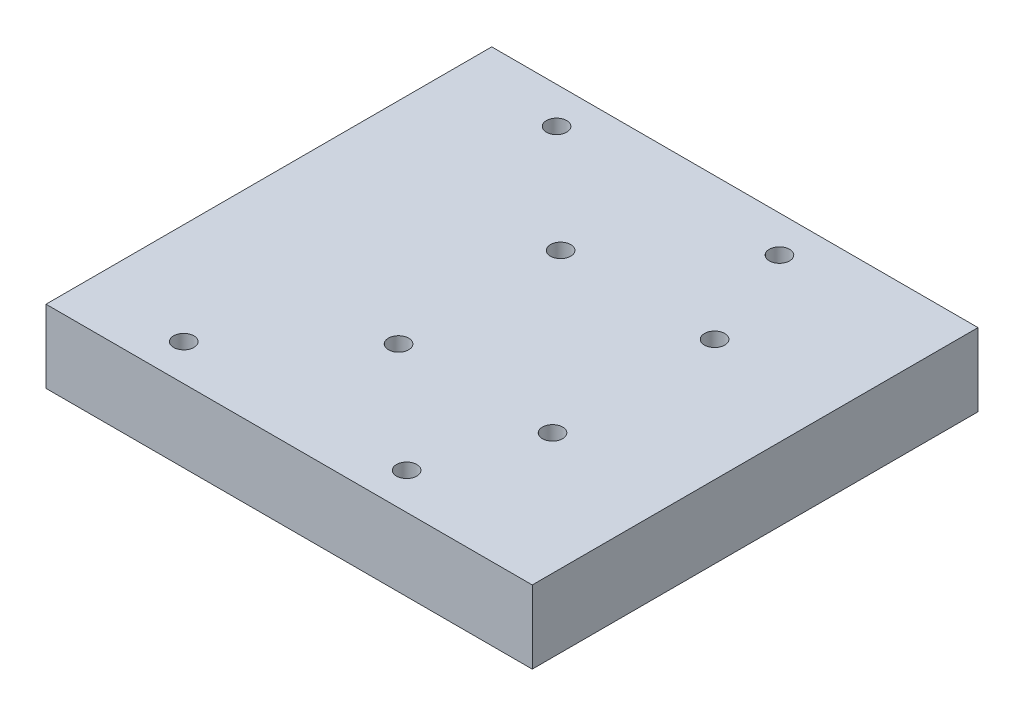
ISO-10303-21;
HEADER;
FILE_DESCRIPTION(('STEP AP214'),'2;1');
FILE_NAME('part.step','',(''),(''),'','','');
FILE_SCHEMA(('AUTOMOTIVE_DESIGN { 1 0 10303 214 1 1 1 1 }'));
ENDSEC;
DATA;
#1=APPLICATION_CONTEXT('core data for automotive mechanical design processes');
#2=APPLICATION_PROTOCOL_DEFINITION('international standard','automotive_design',2000,#1);
#3=PRODUCT_CONTEXT('',#1,'mechanical');
#4=PRODUCT('Part','Part','',(#3));
#5=PRODUCT_RELATED_PRODUCT_CATEGORY('part','',(#4));
#6=PRODUCT_DEFINITION_FORMATION('','',#4);
#7=PRODUCT_DEFINITION_CONTEXT('part definition',#1,'design');
#8=PRODUCT_DEFINITION('design','',#6,#7);
#9=PRODUCT_DEFINITION_SHAPE('','',#8);
#10=(LENGTH_UNIT() NAMED_UNIT(*) SI_UNIT(.MILLI.,.METRE.));
#11=(NAMED_UNIT(*) PLANE_ANGLE_UNIT() SI_UNIT($,.RADIAN.));
#12=(NAMED_UNIT(*) SI_UNIT($,.STERADIAN.) SOLID_ANGLE_UNIT());
#13=UNCERTAINTY_MEASURE_WITH_UNIT(LENGTH_MEASURE(1.E-05),#10,'distance_accuracy_value','');
#14=(GEOMETRIC_REPRESENTATION_CONTEXT(3) GLOBAL_UNCERTAINTY_ASSIGNED_CONTEXT((#13)) GLOBAL_UNIT_ASSIGNED_CONTEXT((#10,
#11,#12)) REPRESENTATION_CONTEXT('',''));
#15=CARTESIAN_POINT('',(0.,0.,0.));
#16=DIRECTION('',(0.,0.,1.));
#17=DIRECTION('',(1.,0.,0.));
#18=AXIS2_PLACEMENT_3D('',#15,#16,#17);
#19=CARTESIAN_POINT('',(60.,18.,-55.));
#20=DIRECTION('',(-1.,0.,0.));
#21=DIRECTION('',(0.,0.,1.));
#22=AXIS2_PLACEMENT_3D('',#19,#20,#21);
#23=PLANE('',#22);
#24=DIRECTION('',(0.,0.,-1.));
#25=VECTOR('',#24,1.);
#26=CARTESIAN_POINT('',(60.,0.,-55.));
#27=LINE('',#26,#25);
#28=CARTESIAN_POINT('',(60.,0.,55.));
#29=VERTEX_POINT('',#28);
#30=CARTESIAN_POINT('',(60.,0.,-55.));
#31=VERTEX_POINT('',#30);
#32=EDGE_CURVE('E96',#29,#31,#27,.T.);
#33=ORIENTED_EDGE('',*,*,#32,.T.);
#34=DIRECTION('',(0.,-1.,0.));
#35=VECTOR('',#34,1.);
#36=CARTESIAN_POINT('',(60.,18.,-55.));
#37=LINE('',#36,#35);
#38=CARTESIAN_POINT('',(60.,18.,-55.));
#39=VERTEX_POINT('',#38);
#40=EDGE_CURVE('E11',#39,#31,#37,.T.);
#41=ORIENTED_EDGE('',*,*,#40,.F.);
#42=DIRECTION('',(0.,0.,-1.));
#43=VECTOR('',#42,1.);
#44=CARTESIAN_POINT('',(60.,18.,-55.));
#45=LINE('',#44,#43);
#46=CARTESIAN_POINT('',(60.,18.,55.));
#47=VERTEX_POINT('',#46);
#48=EDGE_CURVE('E84',#47,#39,#45,.T.);
#49=ORIENTED_EDGE('',*,*,#48,.F.);
#50=DIRECTION('',(0.,-1.,0.));
#51=VECTOR('',#50,1.);
#52=CARTESIAN_POINT('',(60.,18.,55.));
#53=LINE('',#52,#51);
#54=EDGE_CURVE('E92',#47,#29,#53,.T.);
#55=ORIENTED_EDGE('',*,*,#54,.T.);
#56=EDGE_LOOP('',(#33,#41,#49,#55));
#57=FACE_BOUND('',#56,.T.);
#58=ADVANCED_FACE('F33',(#57),#23,.F.);
#59=CARTESIAN_POINT('',(-60.,18.,-55.));
#60=DIRECTION('',(0.,0.,1.));
#61=DIRECTION('',(1.,0.,0.));
#62=AXIS2_PLACEMENT_3D('',#59,#60,#61);
#63=PLANE('',#62);
#64=DIRECTION('',(-1.,0.,0.));
#65=VECTOR('',#64,1.);
#66=CARTESIAN_POINT('',(-60.,0.,-55.));
#67=LINE('',#66,#65);
#68=CARTESIAN_POINT('',(-60.,0.,-55.));
#69=VERTEX_POINT('',#68);
#70=EDGE_CURVE('E88',#31,#69,#67,.T.);
#71=ORIENTED_EDGE('',*,*,#70,.T.);
#72=DIRECTION('',(0.,-1.,0.));
#73=VECTOR('',#72,1.);
#74=CARTESIAN_POINT('',(-60.,18.,-55.));
#75=LINE('',#74,#73);
#76=CARTESIAN_POINT('',(-60.,18.,-55.));
#77=VERTEX_POINT('',#76);
#78=EDGE_CURVE('E41',#77,#69,#75,.T.);
#79=ORIENTED_EDGE('',*,*,#78,.F.);
#80=DIRECTION('',(-1.,0.,0.));
#81=VECTOR('',#80,1.);
#82=CARTESIAN_POINT('',(-60.,18.,-55.));
#83=LINE('',#82,#81);
#84=EDGE_CURVE('E79',#39,#77,#83,.T.);
#85=ORIENTED_EDGE('',*,*,#84,.F.);
#86=ORIENTED_EDGE('',*,*,#40,.T.);
#87=EDGE_LOOP('',(#71,#79,#85,#86));
#88=FACE_BOUND('',#87,.T.);
#89=ADVANCED_FACE('F87',(#88),#63,.F.);
#90=CARTESIAN_POINT('',(-60.,18.,-55.));
#91=DIRECTION('',(1.,0.,0.));
#92=DIRECTION('',(0.,0.,-1.));
#93=AXIS2_PLACEMENT_3D('',#90,#91,#92);
#94=PLANE('',#93);
#95=DIRECTION('',(0.,0.,1.));
#96=VECTOR('',#95,1.);
#97=CARTESIAN_POINT('',(-60.,0.,-55.));
#98=LINE('',#97,#96);
#99=CARTESIAN_POINT('',(-60.,0.,55.));
#100=VERTEX_POINT('',#99);
#101=EDGE_CURVE('E66',#69,#100,#98,.T.);
#102=ORIENTED_EDGE('',*,*,#101,.T.);
#103=DIRECTION('',(0.,-1.,0.));
#104=VECTOR('',#103,1.);
#105=CARTESIAN_POINT('',(-60.,18.,55.));
#106=LINE('',#105,#104);
#107=CARTESIAN_POINT('',(-60.,18.,55.));
#108=VERTEX_POINT('',#107);
#109=EDGE_CURVE('E89',#108,#100,#106,.T.);
#110=ORIENTED_EDGE('',*,*,#109,.F.);
#111=DIRECTION('',(0.,0.,1.));
#112=VECTOR('',#111,1.);
#113=CARTESIAN_POINT('',(-60.,18.,-55.));
#114=LINE('',#113,#112);
#115=EDGE_CURVE('E82',#77,#108,#114,.T.);
#116=ORIENTED_EDGE('',*,*,#115,.F.);
#117=ORIENTED_EDGE('',*,*,#78,.T.);
#118=EDGE_LOOP('',(#102,#110,#116,#117));
#119=FACE_BOUND('',#118,.T.);
#120=ADVANCED_FACE('F90',(#119),#94,.F.);
#121=CARTESIAN_POINT('',(-60.,18.,55.));
#122=DIRECTION('',(0.,0.,-1.));
#123=DIRECTION('',(-1.,0.,0.));
#124=AXIS2_PLACEMENT_3D('',#121,#122,#123);
#125=PLANE('',#124);
#126=DIRECTION('',(1.,0.,0.));
#127=VECTOR('',#126,1.);
#128=CARTESIAN_POINT('',(-60.,0.,55.));
#129=LINE('',#128,#127);
#130=EDGE_CURVE('E72',#100,#29,#129,.T.);
#131=ORIENTED_EDGE('',*,*,#130,.T.);
#132=ORIENTED_EDGE('',*,*,#54,.F.);
#133=DIRECTION('',(1.,0.,0.));
#134=VECTOR('',#133,1.);
#135=CARTESIAN_POINT('',(-60.,18.,55.));
#136=LINE('',#135,#134);
#137=EDGE_CURVE('E49',#108,#47,#136,.T.);
#138=ORIENTED_EDGE('',*,*,#137,.F.);
#139=ORIENTED_EDGE('',*,*,#109,.T.);
#140=EDGE_LOOP('',(#131,#132,#138,#139));
#141=FACE_BOUND('',#140,.T.);
#142=ADVANCED_FACE('F104',(#141),#125,.F.);
#143=CARTESIAN_POINT('',(0.,18.,0.));
#144=DIRECTION('',(0.,1.,0.));
#145=DIRECTION('',(0.,0.,1.));
#146=AXIS2_PLACEMENT_3D('',#143,#144,#145);
#147=PLANE('',#146);
#148=CARTESIAN_POINT('',(-8.00000000000001,18.,-20.));
#149=DIRECTION('',(0.,-1.,0.));
#150=DIRECTION('',(0.,0.,-1.));
#151=AXIS2_PLACEMENT_3D('',#148,#149,#150);
#152=CIRCLE('',#151,2.5);
#153=CARTESIAN_POINT('',(-8.00000000000001,18.,-22.5));
#154=VERTEX_POINT('',#153);
#155=EDGE_CURVE('E151',#154,#154,#152,.T.);
#156=ORIENTED_EDGE('',*,*,#155,.T.);
#157=EDGE_LOOP('',(#156));
#158=FACE_BOUND('',#157,.T.);
#159=CARTESIAN_POINT('',(30.,18.,-20.));
#160=DIRECTION('',(0.,-1.,0.));
#161=DIRECTION('',(0.,0.,-1.));
#162=AXIS2_PLACEMENT_3D('',#159,#160,#161);
#163=CIRCLE('',#162,2.5);
#164=CARTESIAN_POINT('',(30.,18.,-22.5));
#165=VERTEX_POINT('',#164);
#166=EDGE_CURVE('E145',#165,#165,#163,.T.);
#167=ORIENTED_EDGE('',*,*,#166,.T.);
#168=EDGE_LOOP('',(#167));
#169=FACE_BOUND('',#168,.T.);
#170=CARTESIAN_POINT('',(30.,18.,20.));
#171=DIRECTION('',(0.,-1.,0.));
#172=DIRECTION('',(0.,0.,-1.));
#173=AXIS2_PLACEMENT_3D('',#170,#171,#172);
#174=CIRCLE('',#173,2.5);
#175=CARTESIAN_POINT('',(30.,18.,17.5));
#176=VERTEX_POINT('',#175);
#177=EDGE_CURVE('E139',#176,#176,#174,.T.);
#178=ORIENTED_EDGE('',*,*,#177,.T.);
#179=EDGE_LOOP('',(#178));
#180=FACE_BOUND('',#179,.T.);
#181=CARTESIAN_POINT('',(-8.00000000000001,18.,20.));
#182=DIRECTION('',(0.,-1.,0.));
#183=DIRECTION('',(0.,0.,-1.));
#184=AXIS2_PLACEMENT_3D('',#181,#182,#183);
#185=CIRCLE('',#184,2.5);
#186=CARTESIAN_POINT('',(-8.00000000000001,18.,17.5));
#187=VERTEX_POINT('',#186);
#188=EDGE_CURVE('E133',#187,#187,#185,.T.);
#189=ORIENTED_EDGE('',*,*,#188,.T.);
#190=EDGE_LOOP('',(#189));
#191=FACE_BOUND('',#190,.T.);
#192=CARTESIAN_POINT('',(20.,18.,-46.));
#193=DIRECTION('',(0.,-1.,0.));
#194=DIRECTION('',(0.,0.,-1.));
#195=AXIS2_PLACEMENT_3D('',#192,#193,#194);
#196=CIRCLE('',#195,2.5);
#197=CARTESIAN_POINT('',(20.,18.,-48.5));
#198=VERTEX_POINT('',#197);
#199=EDGE_CURVE('E127',#198,#198,#196,.T.);
#200=ORIENTED_EDGE('',*,*,#199,.T.);
#201=EDGE_LOOP('',(#200));
#202=FACE_BOUND('',#201,.T.);
#203=CARTESIAN_POINT('',(-35.,18.,-46.));
#204=DIRECTION('',(0.,-1.,0.));
#205=DIRECTION('',(0.,0.,-1.));
#206=AXIS2_PLACEMENT_3D('',#203,#204,#205);
#207=CIRCLE('',#206,2.5);
#208=CARTESIAN_POINT('',(-35.,18.,-48.5));
#209=VERTEX_POINT('',#208);
#210=EDGE_CURVE('E121',#209,#209,#207,.T.);
#211=ORIENTED_EDGE('',*,*,#210,.T.);
#212=EDGE_LOOP('',(#211));
#213=FACE_BOUND('',#212,.T.);
#214=CARTESIAN_POINT('',(-35.,18.,46.));
#215=DIRECTION('',(0.,-1.,0.));
#216=DIRECTION('',(0.,0.,-1.));
#217=AXIS2_PLACEMENT_3D('',#214,#215,#216);
#218=CIRCLE('',#217,2.5);
#219=CARTESIAN_POINT('',(-35.,18.,43.5));
#220=VERTEX_POINT('',#219);
#221=EDGE_CURVE('E115',#220,#220,#218,.T.);
#222=ORIENTED_EDGE('',*,*,#221,.T.);
#223=EDGE_LOOP('',(#222));
#224=FACE_BOUND('',#223,.T.);
#225=CARTESIAN_POINT('',(20.,18.,46.));
#226=DIRECTION('',(0.,-1.,0.));
#227=DIRECTION('',(0.,0.,-1.));
#228=AXIS2_PLACEMENT_3D('',#225,#226,#227);
#229=CIRCLE('',#228,2.5);
#230=CARTESIAN_POINT('',(20.,18.,43.5));
#231=VERTEX_POINT('',#230);
#232=EDGE_CURVE('E99',#231,#231,#229,.T.);
#233=ORIENTED_EDGE('',*,*,#232,.T.);
#234=EDGE_LOOP('',(#233));
#235=FACE_BOUND('',#234,.T.);
#236=ORIENTED_EDGE('',*,*,#48,.T.);
#237=ORIENTED_EDGE('',*,*,#84,.T.);
#238=ORIENTED_EDGE('',*,*,#115,.T.);
#239=ORIENTED_EDGE('',*,*,#137,.T.);
#240=EDGE_LOOP('',(#236,#237,#238,#239));
#241=FACE_BOUND('',#240,.T.);
#242=ADVANCED_FACE('F80',(#158,#169,#180,#191,#202,#213,#224,#235,#241),#147,.T.);
#243=CARTESIAN_POINT('',(0.,0.,0.));
#244=DIRECTION('',(0.,1.,0.));
#245=DIRECTION('',(0.,0.,1.));
#246=AXIS2_PLACEMENT_3D('',#243,#244,#245);
#247=PLANE('',#246);
#248=CARTESIAN_POINT('',(-8.00000000000001,0.,-20.));
#249=DIRECTION('',(0.,-1.,0.));
#250=DIRECTION('',(0.,0.,-1.));
#251=AXIS2_PLACEMENT_3D('',#248,#249,#250);
#252=CIRCLE('',#251,2.49999999999999);
#253=CARTESIAN_POINT('',(-8.00000000000001,0.,-22.5));
#254=VERTEX_POINT('',#253);
#255=EDGE_CURVE('E154',#254,#254,#252,.T.);
#256=ORIENTED_EDGE('',*,*,#255,.F.);
#257=EDGE_LOOP('',(#256));
#258=FACE_BOUND('',#257,.T.);
#259=CARTESIAN_POINT('',(30.,0.,-20.));
#260=DIRECTION('',(0.,-1.,0.));
#261=DIRECTION('',(0.,0.,-1.));
#262=AXIS2_PLACEMENT_3D('',#259,#260,#261);
#263=CIRCLE('',#262,2.49999999999999);
#264=CARTESIAN_POINT('',(30.,0.,-22.5));
#265=VERTEX_POINT('',#264);
#266=EDGE_CURVE('E148',#265,#265,#263,.T.);
#267=ORIENTED_EDGE('',*,*,#266,.F.);
#268=EDGE_LOOP('',(#267));
#269=FACE_BOUND('',#268,.T.);
#270=CARTESIAN_POINT('',(30.,0.,20.));
#271=DIRECTION('',(0.,-1.,0.));
#272=DIRECTION('',(0.,0.,-1.));
#273=AXIS2_PLACEMENT_3D('',#270,#271,#272);
#274=CIRCLE('',#273,2.49999999999999);
#275=CARTESIAN_POINT('',(30.,0.,17.5));
#276=VERTEX_POINT('',#275);
#277=EDGE_CURVE('E142',#276,#276,#274,.T.);
#278=ORIENTED_EDGE('',*,*,#277,.F.);
#279=EDGE_LOOP('',(#278));
#280=FACE_BOUND('',#279,.T.);
#281=CARTESIAN_POINT('',(-8.00000000000001,0.,20.));
#282=DIRECTION('',(0.,-1.,0.));
#283=DIRECTION('',(0.,0.,-1.));
#284=AXIS2_PLACEMENT_3D('',#281,#282,#283);
#285=CIRCLE('',#284,2.49999999999999);
#286=CARTESIAN_POINT('',(-8.00000000000001,0.,17.5));
#287=VERTEX_POINT('',#286);
#288=EDGE_CURVE('E136',#287,#287,#285,.T.);
#289=ORIENTED_EDGE('',*,*,#288,.F.);
#290=EDGE_LOOP('',(#289));
#291=FACE_BOUND('',#290,.T.);
#292=CARTESIAN_POINT('',(20.,0.,-46.));
#293=DIRECTION('',(0.,-1.,0.));
#294=DIRECTION('',(0.,0.,-1.));
#295=AXIS2_PLACEMENT_3D('',#292,#293,#294);
#296=CIRCLE('',#295,2.49999999999999);
#297=CARTESIAN_POINT('',(20.,0.,-48.5));
#298=VERTEX_POINT('',#297);
#299=EDGE_CURVE('E130',#298,#298,#296,.T.);
#300=ORIENTED_EDGE('',*,*,#299,.F.);
#301=EDGE_LOOP('',(#300));
#302=FACE_BOUND('',#301,.T.);
#303=CARTESIAN_POINT('',(-35.,0.,-46.));
#304=DIRECTION('',(0.,-1.,0.));
#305=DIRECTION('',(0.,0.,-1.));
#306=AXIS2_PLACEMENT_3D('',#303,#304,#305);
#307=CIRCLE('',#306,2.49999999999999);
#308=CARTESIAN_POINT('',(-35.,0.,-48.5));
#309=VERTEX_POINT('',#308);
#310=EDGE_CURVE('E124',#309,#309,#307,.T.);
#311=ORIENTED_EDGE('',*,*,#310,.F.);
#312=EDGE_LOOP('',(#311));
#313=FACE_BOUND('',#312,.T.);
#314=CARTESIAN_POINT('',(-35.,0.,46.));
#315=DIRECTION('',(0.,-1.,0.));
#316=DIRECTION('',(0.,0.,-1.));
#317=AXIS2_PLACEMENT_3D('',#314,#315,#316);
#318=CIRCLE('',#317,2.49999999999999);
#319=CARTESIAN_POINT('',(-35.,0.,43.5));
#320=VERTEX_POINT('',#319);
#321=EDGE_CURVE('E118',#320,#320,#318,.T.);
#322=ORIENTED_EDGE('',*,*,#321,.F.);
#323=EDGE_LOOP('',(#322));
#324=FACE_BOUND('',#323,.T.);
#325=CARTESIAN_POINT('',(20.,0.,46.));
#326=DIRECTION('',(0.,-1.,0.));
#327=DIRECTION('',(0.,0.,-1.));
#328=AXIS2_PLACEMENT_3D('',#325,#326,#327);
#329=CIRCLE('',#328,2.49999999999999);
#330=CARTESIAN_POINT('',(20.,0.,43.5));
#331=VERTEX_POINT('',#330);
#332=EDGE_CURVE('E112',#331,#331,#329,.T.);
#333=ORIENTED_EDGE('',*,*,#332,.F.);
#334=EDGE_LOOP('',(#333));
#335=FACE_BOUND('',#334,.T.);
#336=ORIENTED_EDGE('',*,*,#32,.F.);
#337=ORIENTED_EDGE('',*,*,#130,.F.);
#338=ORIENTED_EDGE('',*,*,#101,.F.);
#339=ORIENTED_EDGE('',*,*,#70,.F.);
#340=EDGE_LOOP('',(#336,#337,#338,#339));
#341=FACE_BOUND('',#340,.T.);
#342=ADVANCED_FACE('F107',(#258,#269,#280,#291,#302,#313,#324,#335,#341),#247,.F.);
#343=CARTESIAN_POINT('',(20.,0.,46.));
#344=DIRECTION('',(0.,-1.,0.));
#345=DIRECTION('',(0.,0.,-1.));
#346=AXIS2_PLACEMENT_3D('',#343,#344,#345);
#347=CYLINDRICAL_SURFACE('',#346,2.49999999999999);
#348=ORIENTED_EDGE('',*,*,#232,.F.);
#349=EDGE_LOOP('',(#348));
#350=FACE_BOUND('',#349,.T.);
#351=ORIENTED_EDGE('',*,*,#332,.T.);
#352=EDGE_LOOP('',(#351));
#353=FACE_BOUND('',#352,.T.);
#354=ADVANCED_FACE('F162',(#350,#353),#347,.F.);
#355=CARTESIAN_POINT('',(-35.,0.,46.));
#356=DIRECTION('',(0.,-1.,0.));
#357=DIRECTION('',(0.,0.,-1.));
#358=AXIS2_PLACEMENT_3D('',#355,#356,#357);
#359=CYLINDRICAL_SURFACE('',#358,2.49999999999999);
#360=ORIENTED_EDGE('',*,*,#221,.F.);
#361=EDGE_LOOP('',(#360));
#362=FACE_BOUND('',#361,.T.);
#363=ORIENTED_EDGE('',*,*,#321,.T.);
#364=EDGE_LOOP('',(#363));
#365=FACE_BOUND('',#364,.T.);
#366=ADVANCED_FACE('F179',(#362,#365),#359,.F.);
#367=CARTESIAN_POINT('',(-35.,0.,-46.));
#368=DIRECTION('',(0.,-1.,0.));
#369=DIRECTION('',(0.,0.,-1.));
#370=AXIS2_PLACEMENT_3D('',#367,#368,#369);
#371=CYLINDRICAL_SURFACE('',#370,2.49999999999999);
#372=ORIENTED_EDGE('',*,*,#210,.F.);
#373=EDGE_LOOP('',(#372));
#374=FACE_BOUND('',#373,.T.);
#375=ORIENTED_EDGE('',*,*,#310,.T.);
#376=EDGE_LOOP('',(#375));
#377=FACE_BOUND('',#376,.T.);
#378=ADVANCED_FACE('F186',(#374,#377),#371,.F.);
#379=CARTESIAN_POINT('',(20.,0.,-46.));
#380=DIRECTION('',(0.,-1.,0.));
#381=DIRECTION('',(0.,0.,-1.));
#382=AXIS2_PLACEMENT_3D('',#379,#380,#381);
#383=CYLINDRICAL_SURFACE('',#382,2.49999999999999);
#384=ORIENTED_EDGE('',*,*,#199,.F.);
#385=EDGE_LOOP('',(#384));
#386=FACE_BOUND('',#385,.T.);
#387=ORIENTED_EDGE('',*,*,#299,.T.);
#388=EDGE_LOOP('',(#387));
#389=FACE_BOUND('',#388,.T.);
#390=ADVANCED_FACE('F224',(#386,#389),#383,.F.);
#391=CARTESIAN_POINT('',(-8.00000000000001,0.,20.));
#392=DIRECTION('',(0.,-1.,0.));
#393=DIRECTION('',(0.,0.,-1.));
#394=AXIS2_PLACEMENT_3D('',#391,#392,#393);
#395=CYLINDRICAL_SURFACE('',#394,2.49999999999999);
#396=ORIENTED_EDGE('',*,*,#188,.F.);
#397=EDGE_LOOP('',(#396));
#398=FACE_BOUND('',#397,.T.);
#399=ORIENTED_EDGE('',*,*,#288,.T.);
#400=EDGE_LOOP('',(#399));
#401=FACE_BOUND('',#400,.T.);
#402=ADVANCED_FACE('F229',(#398,#401),#395,.F.);
#403=CARTESIAN_POINT('',(30.,0.,20.));
#404=DIRECTION('',(0.,-1.,0.));
#405=DIRECTION('',(0.,0.,-1.));
#406=AXIS2_PLACEMENT_3D('',#403,#404,#405);
#407=CYLINDRICAL_SURFACE('',#406,2.49999999999999);
#408=ORIENTED_EDGE('',*,*,#177,.F.);
#409=EDGE_LOOP('',(#408));
#410=FACE_BOUND('',#409,.T.);
#411=ORIENTED_EDGE('',*,*,#277,.T.);
#412=EDGE_LOOP('',(#411));
#413=FACE_BOUND('',#412,.T.);
#414=ADVANCED_FACE('F235',(#410,#413),#407,.F.);
#415=CARTESIAN_POINT('',(30.,0.,-20.));
#416=DIRECTION('',(0.,-1.,0.));
#417=DIRECTION('',(0.,0.,-1.));
#418=AXIS2_PLACEMENT_3D('',#415,#416,#417);
#419=CYLINDRICAL_SURFACE('',#418,2.49999999999999);
#420=ORIENTED_EDGE('',*,*,#166,.F.);
#421=EDGE_LOOP('',(#420));
#422=FACE_BOUND('',#421,.T.);
#423=ORIENTED_EDGE('',*,*,#266,.T.);
#424=EDGE_LOOP('',(#423));
#425=FACE_BOUND('',#424,.T.);
#426=ADVANCED_FACE('F239',(#422,#425),#419,.F.);
#427=CARTESIAN_POINT('',(-8.00000000000001,0.,-20.));
#428=DIRECTION('',(0.,-1.,0.));
#429=DIRECTION('',(0.,0.,-1.));
#430=AXIS2_PLACEMENT_3D('',#427,#428,#429);
#431=CYLINDRICAL_SURFACE('',#430,2.49999999999999);
#432=ORIENTED_EDGE('',*,*,#155,.F.);
#433=EDGE_LOOP('',(#432));
#434=FACE_BOUND('',#433,.T.);
#435=ORIENTED_EDGE('',*,*,#255,.T.);
#436=EDGE_LOOP('',(#435));
#437=FACE_BOUND('',#436,.T.);
#438=ADVANCED_FACE('F158',(#434,#437),#431,.F.);
#439=CLOSED_SHELL('',(#58,#89,#120,#142,#242,#342,#354,#366,#378,#390,#402,#414,#426,#438));
#440=MANIFOLD_SOLID_BREP('B2',#439);
#441=ADVANCED_BREP_SHAPE_REPRESENTATION('',(#18,#440),#14);
#442=SHAPE_DEFINITION_REPRESENTATION(#9,#441);
ENDSEC;
END-ISO-10303-21;
